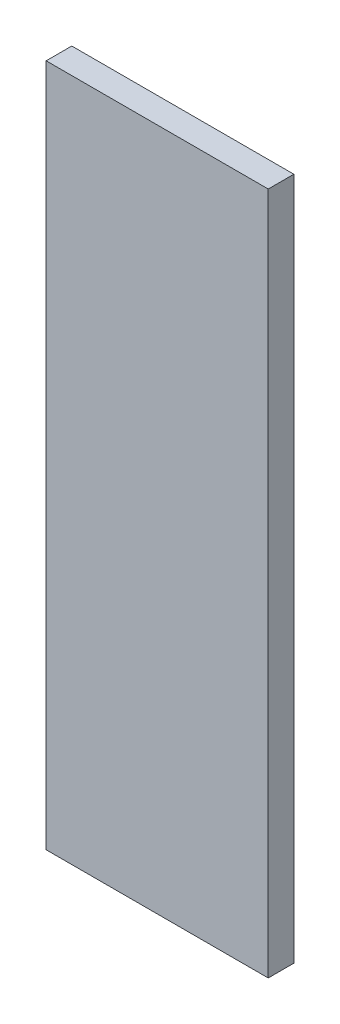
ISO-10303-21;
HEADER;
FILE_DESCRIPTION(('STEP AP214'),'2;1');
FILE_NAME('part.step','',(''),(''),'','','');
FILE_SCHEMA(('AUTOMOTIVE_DESIGN { 1 0 10303 214 1 1 1 1 }'));
ENDSEC;
DATA;
#1=APPLICATION_CONTEXT('core data for automotive mechanical design processes');
#2=APPLICATION_PROTOCOL_DEFINITION('international standard','automotive_design',2000,#1);
#3=PRODUCT_CONTEXT('',#1,'mechanical');
#4=PRODUCT('Part','Part','',(#3));
#5=PRODUCT_RELATED_PRODUCT_CATEGORY('part','',(#4));
#6=PRODUCT_DEFINITION_FORMATION('','',#4);
#7=PRODUCT_DEFINITION_CONTEXT('part definition',#1,'design');
#8=PRODUCT_DEFINITION('design','',#6,#7);
#9=PRODUCT_DEFINITION_SHAPE('','',#8);
#10=(LENGTH_UNIT() NAMED_UNIT(*) SI_UNIT(.MILLI.,.METRE.));
#11=(NAMED_UNIT(*) PLANE_ANGLE_UNIT() SI_UNIT($,.RADIAN.));
#12=(NAMED_UNIT(*) SI_UNIT($,.STERADIAN.) SOLID_ANGLE_UNIT());
#13=UNCERTAINTY_MEASURE_WITH_UNIT(LENGTH_MEASURE(1.E-05),#10,'distance_accuracy_value','');
#14=(GEOMETRIC_REPRESENTATION_CONTEXT(3) GLOBAL_UNCERTAINTY_ASSIGNED_CONTEXT((#13)) GLOBAL_UNIT_ASSIGNED_CONTEXT((#10,
#11,#12)) REPRESENTATION_CONTEXT('',''));
#15=CARTESIAN_POINT('',(0.,0.,0.));
#16=DIRECTION('',(0.,0.,1.));
#17=DIRECTION('',(1.,0.,0.));
#18=AXIS2_PLACEMENT_3D('',#15,#16,#17);
#19=CARTESIAN_POINT('',(-49.2574320837194,-418.059577713801,19.05));
#20=DIRECTION('',(0.,1.,0.));
#21=DIRECTION('',(0.,0.,1.));
#22=AXIS2_PLACEMENT_3D('',#19,#20,#21);
#23=PLANE('',#22);
#24=DIRECTION('',(1.,0.,0.));
#25=VECTOR('',#24,1.);
#26=CARTESIAN_POINT('',(-49.2574320837194,-418.059577713801,0.));
#27=LINE('',#26,#25);
#28=CARTESIAN_POINT('',(-49.2574320837194,-418.059577713801,0.));
#29=VERTEX_POINT('',#28);
#30=CARTESIAN_POINT('',(115.842567916281,-418.059577713801,0.));
#31=VERTEX_POINT('',#30);
#32=EDGE_CURVE('E106',#29,#31,#27,.T.);
#33=ORIENTED_EDGE('',*,*,#32,.T.);
#34=DIRECTION('',(0.,0.,-1.));
#35=VECTOR('',#34,1.);
#36=CARTESIAN_POINT('',(115.842567916281,-418.059577713801,19.05));
#37=LINE('',#36,#35);
#38=CARTESIAN_POINT('',(115.842567916281,-418.059577713801,19.05));
#39=VERTEX_POINT('',#38);
#40=EDGE_CURVE('E11',#39,#31,#37,.T.);
#41=ORIENTED_EDGE('',*,*,#40,.F.);
#42=DIRECTION('',(1.,0.,0.));
#43=VECTOR('',#42,1.);
#44=CARTESIAN_POINT('',(-49.2574320837194,-418.059577713801,19.05));
#45=LINE('',#44,#43);
#46=CARTESIAN_POINT('',(-49.2574320837194,-418.059577713801,19.05));
#47=VERTEX_POINT('',#46);
#48=EDGE_CURVE('E79',#47,#39,#45,.T.);
#49=ORIENTED_EDGE('',*,*,#48,.F.);
#50=DIRECTION('',(0.,0.,-1.));
#51=VECTOR('',#50,1.);
#52=CARTESIAN_POINT('',(-49.2574320837194,-418.059577713801,19.05));
#53=LINE('',#52,#51);
#54=EDGE_CURVE('E102',#47,#29,#53,.T.);
#55=ORIENTED_EDGE('',*,*,#54,.T.);
#56=EDGE_LOOP('',(#33,#41,#49,#55));
#57=FACE_BOUND('',#56,.T.);
#58=ADVANCED_FACE('F39',(#57),#23,.F.);
#59=CARTESIAN_POINT('',(115.842567916281,89.9404222861987,19.05));
#60=DIRECTION('',(1.,0.,0.));
#61=DIRECTION('',(0.,1.,0.));
#62=AXIS2_PLACEMENT_3D('',#59,#60,#61);
#63=PLANE('',#62);
#64=DIRECTION('',(0.,-1.,0.));
#65=VECTOR('',#64,1.);
#66=CARTESIAN_POINT('',(115.842567916281,89.9404222861987,0.));
#67=LINE('',#66,#65);
#68=CARTESIAN_POINT('',(115.842567916281,89.9404222861987,0.));
#69=VERTEX_POINT('',#68);
#70=EDGE_CURVE('E88',#69,#31,#67,.T.);
#71=ORIENTED_EDGE('',*,*,#70,.F.);
#72=DIRECTION('',(0.,0.,-1.));
#73=VECTOR('',#72,1.);
#74=CARTESIAN_POINT('',(115.842567916281,89.9404222861987,19.05));
#75=LINE('',#74,#73);
#76=CARTESIAN_POINT('',(115.842567916281,89.9404222861987,19.05));
#77=VERTEX_POINT('',#76);
#78=EDGE_CURVE('E48',#77,#69,#75,.T.);
#79=ORIENTED_EDGE('',*,*,#78,.F.);
#80=DIRECTION('',(0.,-1.,0.));
#81=VECTOR('',#80,1.);
#82=CARTESIAN_POINT('',(115.842567916281,89.9404222861987,19.05));
#83=LINE('',#82,#81);
#84=EDGE_CURVE('E86',#77,#39,#83,.T.);
#85=ORIENTED_EDGE('',*,*,#84,.T.);
#86=ORIENTED_EDGE('',*,*,#40,.T.);
#87=EDGE_LOOP('',(#71,#79,#85,#86));
#88=FACE_BOUND('',#87,.T.);
#89=ADVANCED_FACE('F85',(#88),#63,.T.);
#90=CARTESIAN_POINT('',(-49.2574320837194,89.9404222861987,19.05));
#91=DIRECTION('',(0.,1.,0.));
#92=DIRECTION('',(0.,0.,1.));
#93=AXIS2_PLACEMENT_3D('',#90,#91,#92);
#94=PLANE('',#93);
#95=DIRECTION('',(1.,0.,0.));
#96=VECTOR('',#95,1.);
#97=CARTESIAN_POINT('',(-49.2574320837194,89.9404222861987,0.));
#98=LINE('',#97,#96);
#99=CARTESIAN_POINT('',(-49.2574320837194,89.9404222861987,0.));
#100=VERTEX_POINT('',#99);
#101=EDGE_CURVE('E112',#100,#69,#98,.T.);
#102=ORIENTED_EDGE('',*,*,#101,.F.);
#103=DIRECTION('',(0.,0.,-1.));
#104=VECTOR('',#103,1.);
#105=CARTESIAN_POINT('',(-49.2574320837194,89.9404222861987,19.05));
#106=LINE('',#105,#104);
#107=CARTESIAN_POINT('',(-49.2574320837194,89.9404222861987,19.05));
#108=VERTEX_POINT('',#107);
#109=EDGE_CURVE('E71',#108,#100,#106,.T.);
#110=ORIENTED_EDGE('',*,*,#109,.F.);
#111=DIRECTION('',(1.,0.,0.));
#112=VECTOR('',#111,1.);
#113=CARTESIAN_POINT('',(-49.2574320837194,89.9404222861987,19.05));
#114=LINE('',#113,#112);
#115=EDGE_CURVE('E95',#108,#77,#114,.T.);
#116=ORIENTED_EDGE('',*,*,#115,.T.);
#117=ORIENTED_EDGE('',*,*,#78,.T.);
#118=EDGE_LOOP('',(#102,#110,#116,#117));
#119=FACE_BOUND('',#118,.T.);
#120=ADVANCED_FACE('F98',(#119),#94,.T.);
#121=CARTESIAN_POINT('',(-49.2574320837194,89.9404222861987,19.05));
#122=DIRECTION('',(1.,0.,0.));
#123=DIRECTION('',(0.,1.,0.));
#124=AXIS2_PLACEMENT_3D('',#121,#122,#123);
#125=PLANE('',#124);
#126=DIRECTION('',(0.,-1.,0.));
#127=VECTOR('',#126,1.);
#128=CARTESIAN_POINT('',(-49.2574320837194,89.9404222861987,0.));
#129=LINE('',#128,#127);
#130=EDGE_CURVE('E74',#100,#29,#129,.T.);
#131=ORIENTED_EDGE('',*,*,#130,.T.);
#132=ORIENTED_EDGE('',*,*,#54,.F.);
#133=DIRECTION('',(0.,-1.,0.));
#134=VECTOR('',#133,1.);
#135=CARTESIAN_POINT('',(-49.2574320837194,89.9404222861987,19.05));
#136=LINE('',#135,#134);
#137=EDGE_CURVE('E56',#108,#47,#136,.T.);
#138=ORIENTED_EDGE('',*,*,#137,.F.);
#139=ORIENTED_EDGE('',*,*,#109,.T.);
#140=EDGE_LOOP('',(#131,#132,#138,#139));
#141=FACE_BOUND('',#140,.T.);
#142=ADVANCED_FACE('F129',(#141),#125,.F.);
#143=CARTESIAN_POINT('',(0.,0.,19.05));
#144=DIRECTION('',(0.,0.,-1.));
#145=DIRECTION('',(-1.,0.,0.));
#146=AXIS2_PLACEMENT_3D('',#143,#144,#145);
#147=PLANE('',#146);
#148=ORIENTED_EDGE('',*,*,#48,.T.);
#149=ORIENTED_EDGE('',*,*,#84,.F.);
#150=ORIENTED_EDGE('',*,*,#115,.F.);
#151=ORIENTED_EDGE('',*,*,#137,.T.);
#152=EDGE_LOOP('',(#148,#149,#150,#151));
#153=FACE_BOUND('',#152,.T.);
#154=ADVANCED_FACE('F94',(#153),#147,.F.);
#155=CARTESIAN_POINT('',(0.,0.,0.));
#156=DIRECTION('',(0.,0.,-1.));
#157=DIRECTION('',(-1.,0.,0.));
#158=AXIS2_PLACEMENT_3D('',#155,#156,#157);
#159=PLANE('',#158);
#160=ORIENTED_EDGE('',*,*,#32,.F.);
#161=ORIENTED_EDGE('',*,*,#130,.F.);
#162=ORIENTED_EDGE('',*,*,#101,.T.);
#163=ORIENTED_EDGE('',*,*,#70,.T.);
#164=EDGE_LOOP('',(#160,#161,#162,#163));
#165=FACE_BOUND('',#164,.T.);
#166=ADVANCED_FACE('F123',(#165),#159,.T.);
#167=CLOSED_SHELL('',(#58,#89,#120,#142,#154,#166));
#168=MANIFOLD_SOLID_BREP('B2',#167);
#169=ADVANCED_BREP_SHAPE_REPRESENTATION('',(#18,#168),#14);
#170=SHAPE_DEFINITION_REPRESENTATION(#9,#169);
ENDSEC;
END-ISO-10303-21;
